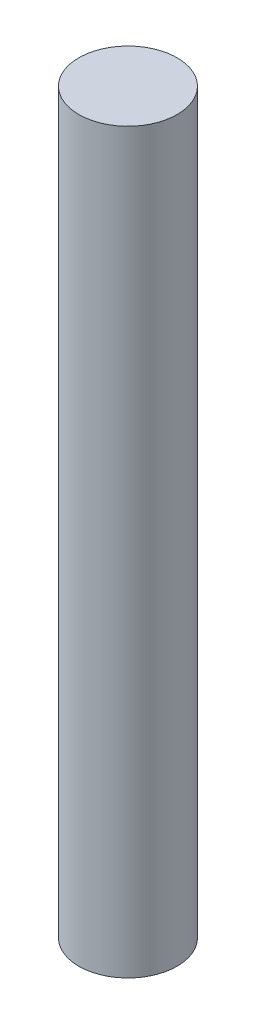
ISO-10303-21;
HEADER;
FILE_DESCRIPTION(('STEP AP214'),'2;1');
FILE_NAME('part.step','',(''),(''),'','','');
FILE_SCHEMA(('AUTOMOTIVE_DESIGN { 1 0 10303 214 1 1 1 1 }'));
ENDSEC;
DATA;
#1=APPLICATION_CONTEXT('core data for automotive mechanical design processes');
#2=APPLICATION_PROTOCOL_DEFINITION('international standard','automotive_design',2000,#1);
#3=PRODUCT_CONTEXT('',#1,'mechanical');
#4=PRODUCT('Part','Part','',(#3));
#5=PRODUCT_RELATED_PRODUCT_CATEGORY('part','',(#4));
#6=PRODUCT_DEFINITION_FORMATION('','',#4);
#7=PRODUCT_DEFINITION_CONTEXT('part definition',#1,'design');
#8=PRODUCT_DEFINITION('design','',#6,#7);
#9=PRODUCT_DEFINITION_SHAPE('','',#8);
#10=(LENGTH_UNIT() NAMED_UNIT(*) SI_UNIT(.MILLI.,.METRE.));
#11=(NAMED_UNIT(*) PLANE_ANGLE_UNIT() SI_UNIT($,.RADIAN.));
#12=(NAMED_UNIT(*) SI_UNIT($,.STERADIAN.) SOLID_ANGLE_UNIT());
#13=UNCERTAINTY_MEASURE_WITH_UNIT(LENGTH_MEASURE(1.E-05),#10,'distance_accuracy_value','');
#14=(GEOMETRIC_REPRESENTATION_CONTEXT(3) GLOBAL_UNCERTAINTY_ASSIGNED_CONTEXT((#13)) GLOBAL_UNIT_ASSIGNED_CONTEXT((#10,
#11,#12)) REPRESENTATION_CONTEXT('',''));
#15=CARTESIAN_POINT('',(0.,0.,0.));
#16=DIRECTION('',(0.,0.,1.));
#17=DIRECTION('',(1.,0.,0.));
#18=AXIS2_PLACEMENT_3D('',#15,#16,#17);
#19=CARTESIAN_POINT('',(0.,60.,0.));
#20=DIRECTION('',(0.,-1.,0.));
#21=DIRECTION('',(0.,0.,-1.));
#22=AXIS2_PLACEMENT_3D('',#19,#20,#21);
#23=CYLINDRICAL_SURFACE('',#22,8.);
#24=CARTESIAN_POINT('',(0.,60.,0.));
#25=DIRECTION('',(0.,1.,0.));
#26=DIRECTION('',(0.,0.,1.));
#27=AXIS2_PLACEMENT_3D('',#24,#25,#26);
#28=CIRCLE('',#27,8.);
#29=CARTESIAN_POINT('',(0.,60.,8.));
#30=VERTEX_POINT('',#29);
#31=EDGE_CURVE('E10',#30,#30,#28,.T.);
#32=ORIENTED_EDGE('',*,*,#31,.F.);
#33=EDGE_LOOP('',(#32));
#34=FACE_BOUND('',#33,.T.);
#35=CARTESIAN_POINT('',(0.,-60.,0.));
#36=DIRECTION('',(0.,1.,0.));
#37=DIRECTION('',(0.,0.,1.));
#38=AXIS2_PLACEMENT_3D('',#35,#36,#37);
#39=CIRCLE('',#38,8.);
#40=CARTESIAN_POINT('',(0.,-60.,8.));
#41=VERTEX_POINT('',#40);
#42=EDGE_CURVE('E36',#41,#41,#39,.T.);
#43=ORIENTED_EDGE('',*,*,#42,.T.);
#44=EDGE_LOOP('',(#43));
#45=FACE_BOUND('',#44,.T.);
#46=ADVANCED_FACE('F33',(#34,#45),#23,.T.);
#47=CARTESIAN_POINT('',(0.,60.,0.));
#48=DIRECTION('',(0.,1.,0.));
#49=DIRECTION('',(0.,0.,1.));
#50=AXIS2_PLACEMENT_3D('',#47,#48,#49);
#51=PLANE('',#50);
#52=ORIENTED_EDGE('',*,*,#31,.T.);
#53=EDGE_LOOP('',(#52));
#54=FACE_BOUND('',#53,.T.);
#55=ADVANCED_FACE('F48',(#54),#51,.T.);
#56=CARTESIAN_POINT('',(0.,-60.,0.));
#57=DIRECTION('',(0.,1.,0.));
#58=DIRECTION('',(0.,0.,1.));
#59=AXIS2_PLACEMENT_3D('',#56,#57,#58);
#60=PLANE('',#59);
#61=ORIENTED_EDGE('',*,*,#42,.F.);
#62=EDGE_LOOP('',(#61));
#63=FACE_BOUND('',#62,.T.);
#64=ADVANCED_FACE('F46',(#63),#60,.F.);
#65=CLOSED_SHELL('',(#46,#55,#64));
#66=MANIFOLD_SOLID_BREP('B2',#65);
#67=ADVANCED_BREP_SHAPE_REPRESENTATION('',(#18,#66),#14);
#68=SHAPE_DEFINITION_REPRESENTATION(#9,#67);
ENDSEC;
END-ISO-10303-21;
